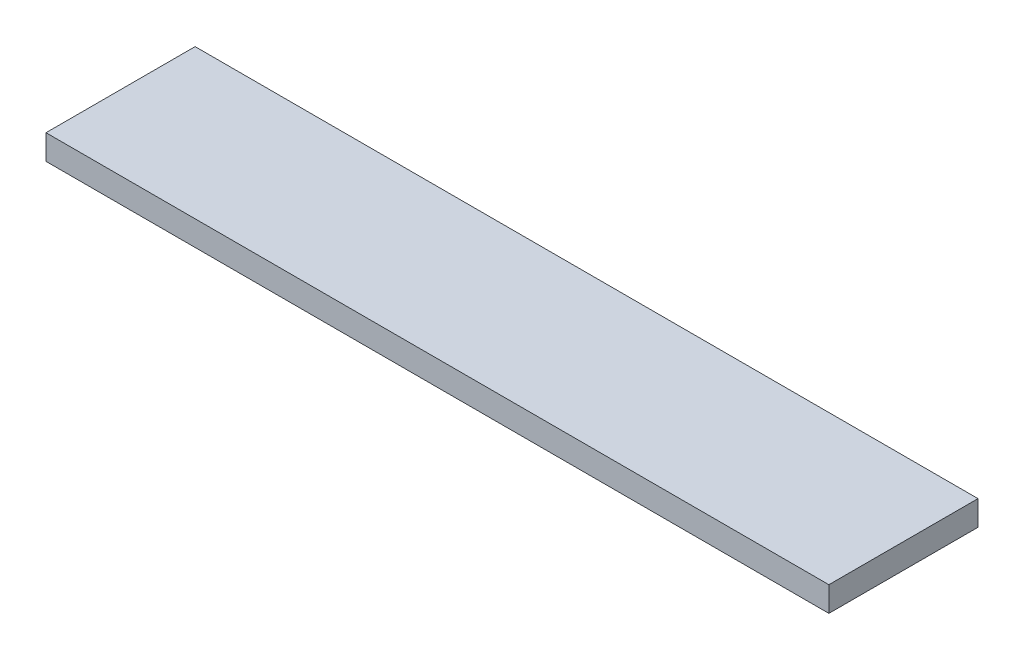
ISO-10303-21;
HEADER;
FILE_DESCRIPTION(('STEP AP214'),'2;1');
FILE_NAME('part.step','',(''),(''),'','','');
FILE_SCHEMA(('AUTOMOTIVE_DESIGN { 1 0 10303 214 1 1 1 1 }'));
ENDSEC;
DATA;
#1=APPLICATION_CONTEXT('core data for automotive mechanical design processes');
#2=APPLICATION_PROTOCOL_DEFINITION('international standard','automotive_design',2000,#1);
#3=PRODUCT_CONTEXT('',#1,'mechanical');
#4=PRODUCT('Part','Part','',(#3));
#5=PRODUCT_RELATED_PRODUCT_CATEGORY('part','',(#4));
#6=PRODUCT_DEFINITION_FORMATION('','',#4);
#7=PRODUCT_DEFINITION_CONTEXT('part definition',#1,'design');
#8=PRODUCT_DEFINITION('design','',#6,#7);
#9=PRODUCT_DEFINITION_SHAPE('','',#8);
#10=(LENGTH_UNIT() NAMED_UNIT(*) SI_UNIT(.MILLI.,.METRE.));
#11=(NAMED_UNIT(*) PLANE_ANGLE_UNIT() SI_UNIT($,.RADIAN.));
#12=(NAMED_UNIT(*) SI_UNIT($,.STERADIAN.) SOLID_ANGLE_UNIT());
#13=UNCERTAINTY_MEASURE_WITH_UNIT(LENGTH_MEASURE(1.E-05),#10,'distance_accuracy_value','');
#14=(GEOMETRIC_REPRESENTATION_CONTEXT(3) GLOBAL_UNCERTAINTY_ASSIGNED_CONTEXT((#13)) GLOBAL_UNIT_ASSIGNED_CONTEXT((#10,
#11,#12)) REPRESENTATION_CONTEXT('',''));
#15=CARTESIAN_POINT('',(0.,0.,0.));
#16=DIRECTION('',(0.,0.,1.));
#17=DIRECTION('',(1.,0.,0.));
#18=AXIS2_PLACEMENT_3D('',#15,#16,#17);
#19=CARTESIAN_POINT('',(-31.5,2.,6.));
#20=DIRECTION('',(1.,0.,0.));
#21=DIRECTION('',(0.,0.,-1.));
#22=AXIS2_PLACEMENT_3D('',#19,#20,#21);
#23=PLANE('',#22);
#24=DIRECTION('',(0.,0.,1.));
#25=VECTOR('',#24,1.);
#26=CARTESIAN_POINT('',(-31.5,0.,6.));
#27=LINE('',#26,#25);
#28=CARTESIAN_POINT('',(-31.5,0.,-6.00000000000001));
#29=VERTEX_POINT('',#28);
#30=CARTESIAN_POINT('',(-31.5,0.,6.));
#31=VERTEX_POINT('',#30);
#32=EDGE_CURVE('E111',#29,#31,#27,.T.);
#33=ORIENTED_EDGE('',*,*,#32,.T.);
#34=DIRECTION('',(0.,-1.,0.));
#35=VECTOR('',#34,1.);
#36=CARTESIAN_POINT('',(-31.5,2.,6.));
#37=LINE('',#36,#35);
#38=CARTESIAN_POINT('',(-31.5,2.,6.));
#39=VERTEX_POINT('',#38);
#40=EDGE_CURVE('E11',#39,#31,#37,.T.);
#41=ORIENTED_EDGE('',*,*,#40,.F.);
#42=DIRECTION('',(0.,0.,1.));
#43=VECTOR('',#42,1.);
#44=CARTESIAN_POINT('',(-31.5,2.,6.));
#45=LINE('',#44,#43);
#46=CARTESIAN_POINT('',(-31.5,2.,-6.00000000000001));
#47=VERTEX_POINT('',#46);
#48=EDGE_CURVE('E95',#47,#39,#45,.T.);
#49=ORIENTED_EDGE('',*,*,#48,.F.);
#50=DIRECTION('',(0.,-1.,0.));
#51=VECTOR('',#50,1.);
#52=CARTESIAN_POINT('',(-31.5,2.,-6.00000000000001));
#53=LINE('',#52,#51);
#54=EDGE_CURVE('E107',#47,#29,#53,.T.);
#55=ORIENTED_EDGE('',*,*,#54,.T.);
#56=EDGE_LOOP('',(#33,#41,#49,#55));
#57=FACE_BOUND('',#56,.T.);
#58=ADVANCED_FACE('F43',(#57),#23,.F.);
#59=CARTESIAN_POINT('',(31.5,2.,5.99999999999999));
#60=DIRECTION('',(0.,0.,-1.));
#61=DIRECTION('',(-1.,0.,0.));
#62=AXIS2_PLACEMENT_3D('',#59,#60,#61);
#63=PLANE('',#62);
#64=DIRECTION('',(1.,0.,0.));
#65=VECTOR('',#64,1.);
#66=CARTESIAN_POINT('',(31.5,0.,5.99999999999999));
#67=LINE('',#66,#65);
#68=CARTESIAN_POINT('',(31.5,0.,5.99999999999999));
#69=VERTEX_POINT('',#68);
#70=EDGE_CURVE('E100',#31,#69,#67,.T.);
#71=ORIENTED_EDGE('',*,*,#70,.T.);
#72=DIRECTION('',(0.,-1.,0.));
#73=VECTOR('',#72,1.);
#74=CARTESIAN_POINT('',(31.5,2.,5.99999999999999));
#75=LINE('',#74,#73);
#76=CARTESIAN_POINT('',(31.5,2.,5.99999999999999));
#77=VERTEX_POINT('',#76);
#78=EDGE_CURVE('E52',#77,#69,#75,.T.);
#79=ORIENTED_EDGE('',*,*,#78,.F.);
#80=DIRECTION('',(1.,0.,0.));
#81=VECTOR('',#80,1.);
#82=CARTESIAN_POINT('',(31.5,2.,5.99999999999999));
#83=LINE('',#82,#81);
#84=EDGE_CURVE('E90',#39,#77,#83,.T.);
#85=ORIENTED_EDGE('',*,*,#84,.F.);
#86=ORIENTED_EDGE('',*,*,#40,.T.);
#87=EDGE_LOOP('',(#71,#79,#85,#86));
#88=FACE_BOUND('',#87,.T.);
#89=ADVANCED_FACE('F99',(#88),#63,.F.);
#90=CARTESIAN_POINT('',(31.5,2.,5.99999999999999));
#91=DIRECTION('',(-1.,0.,0.));
#92=DIRECTION('',(0.,0.,1.));
#93=AXIS2_PLACEMENT_3D('',#90,#91,#92);
#94=PLANE('',#93);
#95=DIRECTION('',(0.,0.,-1.));
#96=VECTOR('',#95,1.);
#97=CARTESIAN_POINT('',(31.5,0.,5.99999999999999));
#98=LINE('',#97,#96);
#99=CARTESIAN_POINT('',(31.5,0.,-6.00000000000001));
#100=VERTEX_POINT('',#99);
#101=EDGE_CURVE('E77',#69,#100,#98,.T.);
#102=ORIENTED_EDGE('',*,*,#101,.T.);
#103=DIRECTION('',(0.,-1.,0.));
#104=VECTOR('',#103,1.);
#105=CARTESIAN_POINT('',(31.5,2.,-6.00000000000001));
#106=LINE('',#105,#104);
#107=CARTESIAN_POINT('',(31.5,2.,-6.00000000000001));
#108=VERTEX_POINT('',#107);
#109=EDGE_CURVE('E102',#108,#100,#106,.T.);
#110=ORIENTED_EDGE('',*,*,#109,.F.);
#111=DIRECTION('',(0.,0.,-1.));
#112=VECTOR('',#111,1.);
#113=CARTESIAN_POINT('',(31.5,2.,5.99999999999999));
#114=LINE('',#113,#112);
#115=EDGE_CURVE('E93',#77,#108,#114,.T.);
#116=ORIENTED_EDGE('',*,*,#115,.F.);
#117=ORIENTED_EDGE('',*,*,#78,.T.);
#118=EDGE_LOOP('',(#102,#110,#116,#117));
#119=FACE_BOUND('',#118,.T.);
#120=ADVANCED_FACE('F103',(#119),#94,.F.);
#121=CARTESIAN_POINT('',(31.5,2.,-6.00000000000001));
#122=DIRECTION('',(0.,0.,1.));
#123=DIRECTION('',(1.,0.,0.));
#124=AXIS2_PLACEMENT_3D('',#121,#122,#123);
#125=PLANE('',#124);
#126=DIRECTION('',(-1.,0.,0.));
#127=VECTOR('',#126,1.);
#128=CARTESIAN_POINT('',(31.5,0.,-6.00000000000001));
#129=LINE('',#128,#127);
#130=EDGE_CURVE('E83',#100,#29,#129,.T.);
#131=ORIENTED_EDGE('',*,*,#130,.T.);
#132=ORIENTED_EDGE('',*,*,#54,.F.);
#133=DIRECTION('',(-1.,0.,0.));
#134=VECTOR('',#133,1.);
#135=CARTESIAN_POINT('',(31.5,2.,-6.00000000000001));
#136=LINE('',#135,#134);
#137=EDGE_CURVE('E60',#108,#47,#136,.T.);
#138=ORIENTED_EDGE('',*,*,#137,.F.);
#139=ORIENTED_EDGE('',*,*,#109,.T.);
#140=EDGE_LOOP('',(#131,#132,#138,#139));
#141=FACE_BOUND('',#140,.T.);
#142=ADVANCED_FACE('F124',(#141),#125,.F.);
#143=CARTESIAN_POINT('',(0.,2.,0.));
#144=DIRECTION('',(0.,1.,0.));
#145=DIRECTION('',(0.,0.,1.));
#146=AXIS2_PLACEMENT_3D('',#143,#144,#145);
#147=PLANE('',#146);
#148=ORIENTED_EDGE('',*,*,#48,.T.);
#149=ORIENTED_EDGE('',*,*,#84,.T.);
#150=ORIENTED_EDGE('',*,*,#115,.T.);
#151=ORIENTED_EDGE('',*,*,#137,.T.);
#152=EDGE_LOOP('',(#148,#149,#150,#151));
#153=FACE_BOUND('',#152,.T.);
#154=ADVANCED_FACE('F91',(#153),#147,.T.);
#155=CARTESIAN_POINT('',(0.,0.,0.));
#156=DIRECTION('',(0.,1.,0.));
#157=DIRECTION('',(0.,0.,1.));
#158=AXIS2_PLACEMENT_3D('',#155,#156,#157);
#159=PLANE('',#158);
#160=ORIENTED_EDGE('',*,*,#32,.F.);
#161=ORIENTED_EDGE('',*,*,#130,.F.);
#162=ORIENTED_EDGE('',*,*,#101,.F.);
#163=ORIENTED_EDGE('',*,*,#70,.F.);
#164=EDGE_LOOP('',(#160,#161,#162,#163));
#165=FACE_BOUND('',#164,.T.);
#166=ADVANCED_FACE('F127',(#165),#159,.F.);
#167=CLOSED_SHELL('',(#58,#89,#120,#142,#154,#166));
#168=MANIFOLD_SOLID_BREP('B2',#167);
#169=ADVANCED_BREP_SHAPE_REPRESENTATION('',(#18,#168),#14);
#170=SHAPE_DEFINITION_REPRESENTATION(#9,#169);
ENDSEC;
END-ISO-10303-21;
